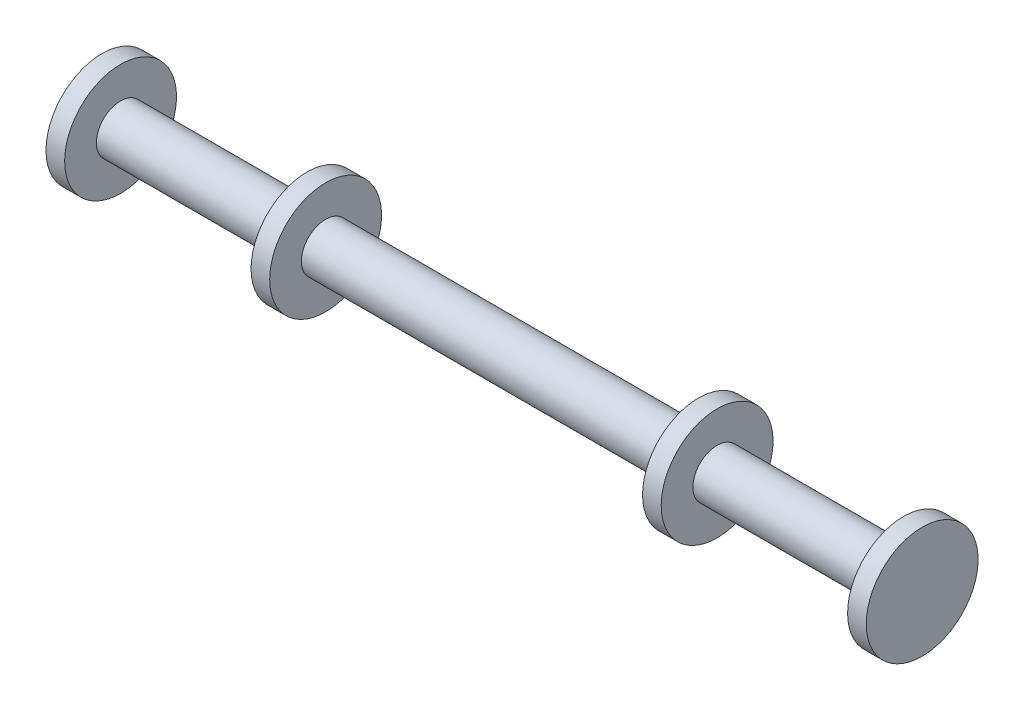
ISO-10303-21;
HEADER;
FILE_DESCRIPTION(('STEP AP214'),'2;1');
FILE_NAME('part.step','',(''),(''),'','','');
FILE_SCHEMA(('AUTOMOTIVE_DESIGN { 1 0 10303 214 1 1 1 1 }'));
ENDSEC;
DATA;
#1=APPLICATION_CONTEXT('core data for automotive mechanical design processes');
#2=APPLICATION_PROTOCOL_DEFINITION('international standard','automotive_design',2000,#1);
#3=PRODUCT_CONTEXT('',#1,'mechanical');
#4=PRODUCT('Part','Part','',(#3));
#5=PRODUCT_RELATED_PRODUCT_CATEGORY('part','',(#4));
#6=PRODUCT_DEFINITION_FORMATION('','',#4);
#7=PRODUCT_DEFINITION_CONTEXT('part definition',#1,'design');
#8=PRODUCT_DEFINITION('design','',#6,#7);
#9=PRODUCT_DEFINITION_SHAPE('','',#8);
#10=(LENGTH_UNIT() NAMED_UNIT(*) SI_UNIT(.MILLI.,.METRE.));
#11=(NAMED_UNIT(*) PLANE_ANGLE_UNIT() SI_UNIT($,.RADIAN.));
#12=(NAMED_UNIT(*) SI_UNIT($,.STERADIAN.) SOLID_ANGLE_UNIT());
#13=UNCERTAINTY_MEASURE_WITH_UNIT(LENGTH_MEASURE(1.E-05),#10,'distance_accuracy_value','');
#14=(GEOMETRIC_REPRESENTATION_CONTEXT(3) GLOBAL_UNCERTAINTY_ASSIGNED_CONTEXT((#13)) GLOBAL_UNIT_ASSIGNED_CONTEXT((#10,
#11,#12)) REPRESENTATION_CONTEXT('',''));
#15=CARTESIAN_POINT('',(0.,0.,0.));
#16=DIRECTION('',(0.,0.,1.));
#17=DIRECTION('',(1.,0.,0.));
#18=AXIS2_PLACEMENT_3D('',#15,#16,#17);
#19=CARTESIAN_POINT('',(-55.88,0.,0.));
#20=DIRECTION('',(-1.,0.,0.));
#21=DIRECTION('',(0.,0.,1.));
#22=AXIS2_PLACEMENT_3D('',#19,#20,#21);
#23=CYLINDRICAL_SURFACE('',#22,3.302);
#24=CARTESIAN_POINT('',(27.94,0.,0.));
#25=DIRECTION('',(-1.,0.,0.));
#26=DIRECTION('',(0.,0.,1.));
#27=AXIS2_PLACEMENT_3D('',#24,#25,#26);
#28=CIRCLE('',#27,3.302);
#29=CARTESIAN_POINT('',(27.94,0.,3.302));
#30=VERTEX_POINT('',#29);
#31=EDGE_CURVE('E53',#30,#30,#28,.T.);
#32=ORIENTED_EDGE('',*,*,#31,.F.);
#33=EDGE_LOOP('',(#32));
#34=FACE_BOUND('',#33,.T.);
#35=CARTESIAN_POINT('',(53.34,0.,0.));
#36=DIRECTION('',(1.,0.,0.));
#37=DIRECTION('',(0.,0.,-1.));
#38=AXIS2_PLACEMENT_3D('',#35,#36,#37);
#39=CIRCLE('',#38,3.302);
#40=CARTESIAN_POINT('',(53.34,0.,-3.302));
#41=VERTEX_POINT('',#40);
#42=EDGE_CURVE('E10',#41,#41,#39,.T.);
#43=ORIENTED_EDGE('',*,*,#42,.F.);
#44=EDGE_LOOP('',(#43));
#45=FACE_BOUND('',#44,.T.);
#46=ADVANCED_FACE('F40',(#34,#45),#23,.T.);
#47=CARTESIAN_POINT('',(-27.94,0.,0.));
#48=DIRECTION('',(1.,0.,0.));
#49=DIRECTION('',(0.,0.,-1.));
#50=AXIS2_PLACEMENT_3D('',#47,#48,#49);
#51=CIRCLE('',#50,3.302);
#52=CARTESIAN_POINT('',(-27.94,0.,-3.302));
#53=VERTEX_POINT('',#52);
#54=EDGE_CURVE('E64',#53,#53,#51,.T.);
#55=ORIENTED_EDGE('',*,*,#54,.F.);
#56=EDGE_LOOP('',(#55));
#57=FACE_BOUND('',#56,.T.);
#58=CARTESIAN_POINT('',(-53.34,0.,0.));
#59=DIRECTION('',(-1.,0.,0.));
#60=DIRECTION('',(0.,0.,1.));
#61=AXIS2_PLACEMENT_3D('',#58,#59,#60);
#62=CIRCLE('',#61,3.302);
#63=CARTESIAN_POINT('',(-53.34,0.,3.302));
#64=VERTEX_POINT('',#63);
#65=EDGE_CURVE('E48',#64,#64,#62,.T.);
#66=ORIENTED_EDGE('',*,*,#65,.F.);
#67=EDGE_LOOP('',(#66));
#68=FACE_BOUND('',#67,.T.);
#69=ADVANCED_FACE('F117',(#57,#68),#23,.T.);
#70=CARTESIAN_POINT('',(-25.4,0.,0.));
#71=DIRECTION('',(-1.,0.,0.));
#72=DIRECTION('',(0.,0.,1.));
#73=AXIS2_PLACEMENT_3D('',#70,#71,#72);
#74=CIRCLE('',#73,3.302);
#75=CARTESIAN_POINT('',(-25.4,0.,3.302));
#76=VERTEX_POINT('',#75);
#77=EDGE_CURVE('E68',#76,#76,#74,.T.);
#78=ORIENTED_EDGE('',*,*,#77,.F.);
#79=EDGE_LOOP('',(#78));
#80=FACE_BOUND('',#79,.T.);
#81=CARTESIAN_POINT('',(25.4,0.,0.));
#82=DIRECTION('',(1.,0.,0.));
#83=DIRECTION('',(0.,0.,-1.));
#84=AXIS2_PLACEMENT_3D('',#81,#82,#83);
#85=CIRCLE('',#84,3.302);
#86=CARTESIAN_POINT('',(25.4,0.,-3.302));
#87=VERTEX_POINT('',#86);
#88=EDGE_CURVE('E58',#87,#87,#85,.T.);
#89=ORIENTED_EDGE('',*,*,#88,.F.);
#90=EDGE_LOOP('',(#89));
#91=FACE_BOUND('',#90,.T.);
#92=ADVANCED_FACE('F119',(#80,#91),#23,.T.);
#93=CARTESIAN_POINT('',(-27.94,3.30199999999999,0.));
#94=DIRECTION('',(1.,0.,0.));
#95=DIRECTION('',(0.,0.,-1.));
#96=AXIS2_PLACEMENT_3D('',#93,#94,#95);
#97=PLANE('',#96);
#98=ORIENTED_EDGE('',*,*,#54,.T.);
#99=EDGE_LOOP('',(#98));
#100=FACE_BOUND('',#99,.T.);
#101=CARTESIAN_POINT('',(-27.94,0.,0.));
#102=DIRECTION('',(-1.,0.,0.));
#103=DIRECTION('',(0.,0.,1.));
#104=AXIS2_PLACEMENT_3D('',#101,#102,#103);
#105=CIRCLE('',#104,7.61999999999999);
#106=CARTESIAN_POINT('',(-27.94,0.,7.61999999999999));
#107=VERTEX_POINT('',#106);
#108=EDGE_CURVE('E72',#107,#107,#105,.T.);
#109=ORIENTED_EDGE('',*,*,#108,.T.);
#110=EDGE_LOOP('',(#109));
#111=FACE_BOUND('',#110,.T.);
#112=ADVANCED_FACE('F128',(#100,#111),#97,.F.);
#113=CARTESIAN_POINT('',(-31.8784218922894,0.,0.));
#114=DIRECTION('',(-1.,0.,0.));
#115=DIRECTION('',(0.,0.,1.));
#116=AXIS2_PLACEMENT_3D('',#113,#114,#115);
#117=CYLINDRICAL_SURFACE('',#116,7.61999999999999);
#118=ORIENTED_EDGE('',*,*,#108,.F.);
#119=EDGE_LOOP('',(#118));
#120=FACE_BOUND('',#119,.T.);
#121=CARTESIAN_POINT('',(-25.4,0.,0.));
#122=DIRECTION('',(-1.,0.,0.));
#123=DIRECTION('',(0.,0.,1.));
#124=AXIS2_PLACEMENT_3D('',#121,#122,#123);
#125=CIRCLE('',#124,7.61999999999999);
#126=CARTESIAN_POINT('',(-25.4,0.,7.61999999999999));
#127=VERTEX_POINT('',#126);
#128=EDGE_CURVE('E76',#127,#127,#125,.T.);
#129=ORIENTED_EDGE('',*,*,#128,.T.);
#130=EDGE_LOOP('',(#129));
#131=FACE_BOUND('',#130,.T.);
#132=ADVANCED_FACE('F133',(#120,#131),#117,.T.);
#133=CARTESIAN_POINT('',(-25.4,7.61999999999999,0.));
#134=DIRECTION('',(-1.,0.,0.));
#135=DIRECTION('',(0.,0.,1.));
#136=AXIS2_PLACEMENT_3D('',#133,#134,#135);
#137=PLANE('',#136);
#138=ORIENTED_EDGE('',*,*,#128,.F.);
#139=EDGE_LOOP('',(#138));
#140=FACE_BOUND('',#139,.T.);
#141=ORIENTED_EDGE('',*,*,#77,.T.);
#142=EDGE_LOOP('',(#141));
#143=FACE_BOUND('',#142,.T.);
#144=ADVANCED_FACE('F155',(#140,#143),#137,.F.);
#145=CARTESIAN_POINT('',(27.94,3.30199999999999,0.));
#146=DIRECTION('',(-1.,0.,0.));
#147=DIRECTION('',(0.,0.,1.));
#148=AXIS2_PLACEMENT_3D('',#145,#146,#147);
#149=PLANE('',#148);
#150=CARTESIAN_POINT('',(27.94,0.,0.));
#151=DIRECTION('',(-1.,0.,0.));
#152=DIRECTION('',(0.,0.,1.));
#153=AXIS2_PLACEMENT_3D('',#150,#151,#152);
#154=CIRCLE('',#153,7.61999999999999);
#155=CARTESIAN_POINT('',(27.94,0.,7.61999999999999));
#156=VERTEX_POINT('',#155);
#157=EDGE_CURVE('E80',#156,#156,#154,.T.);
#158=ORIENTED_EDGE('',*,*,#157,.F.);
#159=EDGE_LOOP('',(#158));
#160=FACE_BOUND('',#159,.T.);
#161=ORIENTED_EDGE('',*,*,#31,.T.);
#162=EDGE_LOOP('',(#161));
#163=FACE_BOUND('',#162,.T.);
#164=ADVANCED_FACE('F149',(#160,#163),#149,.F.);
#165=CARTESIAN_POINT('',(-31.8784218922894,0.,0.));
#166=DIRECTION('',(-1.,0.,0.));
#167=DIRECTION('',(0.,0.,1.));
#168=AXIS2_PLACEMENT_3D('',#165,#166,#167);
#169=CYLINDRICAL_SURFACE('',#168,7.61999999999999);
#170=CARTESIAN_POINT('',(25.4,0.,0.));
#171=DIRECTION('',(-1.,0.,0.));
#172=DIRECTION('',(0.,0.,1.));
#173=AXIS2_PLACEMENT_3D('',#170,#171,#172);
#174=CIRCLE('',#173,7.61999999999999);
#175=CARTESIAN_POINT('',(25.4,0.,7.61999999999999));
#176=VERTEX_POINT('',#175);
#177=EDGE_CURVE('E84',#176,#176,#174,.T.);
#178=ORIENTED_EDGE('',*,*,#177,.F.);
#179=EDGE_LOOP('',(#178));
#180=FACE_BOUND('',#179,.T.);
#181=ORIENTED_EDGE('',*,*,#157,.T.);
#182=EDGE_LOOP('',(#181));
#183=FACE_BOUND('',#182,.T.);
#184=ADVANCED_FACE('F143',(#180,#183),#169,.T.);
#185=CARTESIAN_POINT('',(25.4,3.30199999999999,0.));
#186=DIRECTION('',(1.,0.,0.));
#187=DIRECTION('',(0.,0.,-1.));
#188=AXIS2_PLACEMENT_3D('',#185,#186,#187);
#189=PLANE('',#188);
#190=ORIENTED_EDGE('',*,*,#88,.T.);
#191=EDGE_LOOP('',(#190));
#192=FACE_BOUND('',#191,.T.);
#193=ORIENTED_EDGE('',*,*,#177,.T.);
#194=EDGE_LOOP('',(#193));
#195=FACE_BOUND('',#194,.T.);
#196=ADVANCED_FACE('F139',(#192,#195),#189,.F.);
#197=CARTESIAN_POINT('',(-53.34,3.30199999999998,0.));
#198=DIRECTION('',(-1.,0.,0.));
#199=DIRECTION('',(0.,0.,1.));
#200=AXIS2_PLACEMENT_3D('',#197,#198,#199);
#201=PLANE('',#200);
#202=CARTESIAN_POINT('',(-53.34,0.,0.));
#203=DIRECTION('',(-1.,0.,0.));
#204=DIRECTION('',(0.,0.,1.));
#205=AXIS2_PLACEMENT_3D('',#202,#203,#204);
#206=CIRCLE('',#205,7.61999999999998);
#207=CARTESIAN_POINT('',(-53.34,0.,7.61999999999998));
#208=VERTEX_POINT('',#207);
#209=EDGE_CURVE('E88',#208,#208,#206,.T.);
#210=ORIENTED_EDGE('',*,*,#209,.F.);
#211=EDGE_LOOP('',(#210));
#212=FACE_BOUND('',#211,.T.);
#213=ORIENTED_EDGE('',*,*,#65,.T.);
#214=EDGE_LOOP('',(#213));
#215=FACE_BOUND('',#214,.T.);
#216=ADVANCED_FACE('F142',(#212,#215),#201,.F.);
#217=CARTESIAN_POINT('',(-31.8784218922894,0.,0.));
#218=DIRECTION('',(-1.,0.,0.));
#219=DIRECTION('',(0.,0.,1.));
#220=AXIS2_PLACEMENT_3D('',#217,#218,#219);
#221=CYLINDRICAL_SURFACE('',#220,7.61999999999998);
#222=CARTESIAN_POINT('',(-55.88,0.,0.));
#223=DIRECTION('',(-1.,0.,0.));
#224=DIRECTION('',(0.,0.,1.));
#225=AXIS2_PLACEMENT_3D('',#222,#223,#224);
#226=CIRCLE('',#225,7.61999999999998);
#227=CARTESIAN_POINT('',(-55.88,0.,7.61999999999998));
#228=VERTEX_POINT('',#227);
#229=EDGE_CURVE('E92',#228,#228,#226,.T.);
#230=ORIENTED_EDGE('',*,*,#229,.F.);
#231=EDGE_LOOP('',(#230));
#232=FACE_BOUND('',#231,.T.);
#233=ORIENTED_EDGE('',*,*,#209,.T.);
#234=EDGE_LOOP('',(#233));
#235=FACE_BOUND('',#234,.T.);
#236=ADVANCED_FACE('F207',(#232,#235),#221,.T.);
#237=CARTESIAN_POINT('',(-55.88,3.30199999999999,0.));
#238=DIRECTION('',(1.,0.,0.));
#239=DIRECTION('',(0.,0.,-1.));
#240=AXIS2_PLACEMENT_3D('',#237,#238,#239);
#241=PLANE('',#240);
#242=ORIENTED_EDGE('',*,*,#229,.T.);
#243=EDGE_LOOP('',(#242));
#244=FACE_BOUND('',#243,.T.);
#245=ADVANCED_FACE('F42',(#244),#241,.F.);
#246=CARTESIAN_POINT('',(53.34,3.30199999999999,0.));
#247=DIRECTION('',(1.,0.,0.));
#248=DIRECTION('',(0.,0.,-1.));
#249=AXIS2_PLACEMENT_3D('',#246,#247,#248);
#250=PLANE('',#249);
#251=ORIENTED_EDGE('',*,*,#42,.T.);
#252=EDGE_LOOP('',(#251));
#253=FACE_BOUND('',#252,.T.);
#254=CARTESIAN_POINT('',(53.34,0.,0.));
#255=DIRECTION('',(-1.,0.,0.));
#256=DIRECTION('',(0.,0.,1.));
#257=AXIS2_PLACEMENT_3D('',#254,#255,#256);
#258=CIRCLE('',#257,7.61999999999999);
#259=CARTESIAN_POINT('',(53.34,0.,7.61999999999999));
#260=VERTEX_POINT('',#259);
#261=EDGE_CURVE('E96',#260,#260,#258,.T.);
#262=ORIENTED_EDGE('',*,*,#261,.T.);
#263=EDGE_LOOP('',(#262));
#264=FACE_BOUND('',#263,.T.);
#265=ADVANCED_FACE('F112',(#253,#264),#250,.F.);
#266=CARTESIAN_POINT('',(-31.8784218922894,0.,0.));
#267=DIRECTION('',(-1.,0.,0.));
#268=DIRECTION('',(0.,0.,1.));
#269=AXIS2_PLACEMENT_3D('',#266,#267,#268);
#270=CYLINDRICAL_SURFACE('',#269,7.61999999999999);
#271=ORIENTED_EDGE('',*,*,#261,.F.);
#272=EDGE_LOOP('',(#271));
#273=FACE_BOUND('',#272,.T.);
#274=CARTESIAN_POINT('',(55.88,0.,0.));
#275=DIRECTION('',(-1.,0.,0.));
#276=DIRECTION('',(0.,0.,1.));
#277=AXIS2_PLACEMENT_3D('',#274,#275,#276);
#278=CIRCLE('',#277,7.61999999999999);
#279=CARTESIAN_POINT('',(55.88,0.,7.61999999999999));
#280=VERTEX_POINT('',#279);
#281=EDGE_CURVE('E100',#280,#280,#278,.T.);
#282=ORIENTED_EDGE('',*,*,#281,.T.);
#283=EDGE_LOOP('',(#282));
#284=FACE_BOUND('',#283,.T.);
#285=ADVANCED_FACE('F105',(#273,#284),#270,.T.);
#286=CARTESIAN_POINT('',(55.88,3.30199999999999,0.));
#287=DIRECTION('',(-1.,0.,0.));
#288=DIRECTION('',(0.,0.,1.));
#289=AXIS2_PLACEMENT_3D('',#286,#287,#288);
#290=PLANE('',#289);
#291=ORIENTED_EDGE('',*,*,#281,.F.);
#292=EDGE_LOOP('',(#291));
#293=FACE_BOUND('',#292,.T.);
#294=ADVANCED_FACE('F107',(#293),#290,.F.);
#295=CLOSED_SHELL('',(#46,#69,#92,#112,#132,#144,#164,#184,#196,#216,#236,#245,#265,#285,#294));
#296=MANIFOLD_SOLID_BREP('B2',#295);
#297=ADVANCED_BREP_SHAPE_REPRESENTATION('',(#18,#296),#14);
#298=SHAPE_DEFINITION_REPRESENTATION(#9,#297);
ENDSEC;
END-ISO-10303-21;
